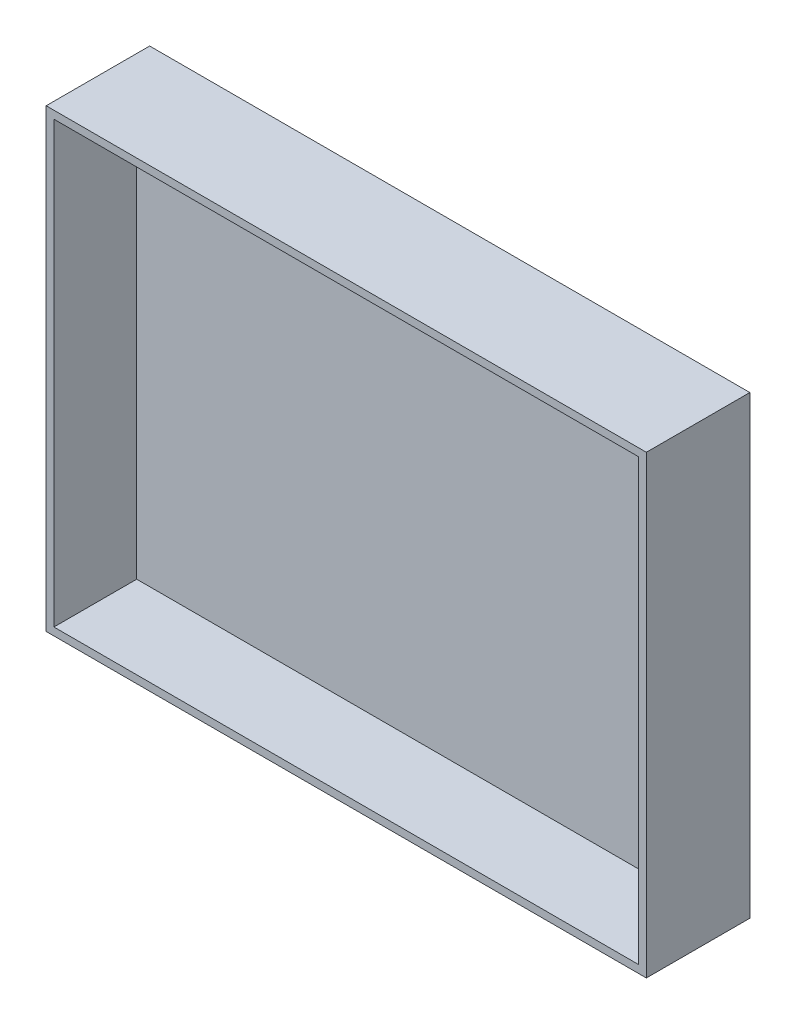
ISO-10303-21;
HEADER;
FILE_DESCRIPTION(('STEP AP214'),'2;1');
FILE_NAME('part.step','',(''),(''),'','','');
FILE_SCHEMA(('AUTOMOTIVE_DESIGN { 1 0 10303 214 1 1 1 1 }'));
ENDSEC;
DATA;
#1=APPLICATION_CONTEXT('core data for automotive mechanical design processes');
#2=APPLICATION_PROTOCOL_DEFINITION('international standard','automotive_design',2000,#1);
#3=PRODUCT_CONTEXT('',#1,'mechanical');
#4=PRODUCT('Part','Part','',(#3));
#5=PRODUCT_RELATED_PRODUCT_CATEGORY('part','',(#4));
#6=PRODUCT_DEFINITION_FORMATION('','',#4);
#7=PRODUCT_DEFINITION_CONTEXT('part definition',#1,'design');
#8=PRODUCT_DEFINITION('design','',#6,#7);
#9=PRODUCT_DEFINITION_SHAPE('','',#8);
#10=(LENGTH_UNIT() NAMED_UNIT(*) SI_UNIT(.MILLI.,.METRE.));
#11=(NAMED_UNIT(*) PLANE_ANGLE_UNIT() SI_UNIT($,.RADIAN.));
#12=(NAMED_UNIT(*) SI_UNIT($,.STERADIAN.) SOLID_ANGLE_UNIT());
#13=UNCERTAINTY_MEASURE_WITH_UNIT(LENGTH_MEASURE(1.E-05),#10,'distance_accuracy_value','');
#14=(GEOMETRIC_REPRESENTATION_CONTEXT(3) GLOBAL_UNCERTAINTY_ASSIGNED_CONTEXT((#13)) GLOBAL_UNIT_ASSIGNED_CONTEXT((#10,
#11,#12)) REPRESENTATION_CONTEXT('',''));
#15=CARTESIAN_POINT('',(0.,0.,0.));
#16=DIRECTION('',(0.,0.,1.));
#17=DIRECTION('',(1.,0.,0.));
#18=AXIS2_PLACEMENT_3D('',#15,#16,#17);
#19=CARTESIAN_POINT('',(28.25,-21.25,10.));
#20=DIRECTION('',(-1.,0.,0.));
#21=DIRECTION('',(0.,0.,1.));
#22=AXIS2_PLACEMENT_3D('',#19,#20,#21);
#23=PLANE('',#22);
#24=DIRECTION('',(0.,0.,-1.));
#25=VECTOR('',#24,1.);
#26=CARTESIAN_POINT('',(28.25,21.25,10.));
#27=LINE('',#26,#25);
#28=CARTESIAN_POINT('',(28.25,21.25,10.));
#29=VERTEX_POINT('',#28);
#30=CARTESIAN_POINT('',(28.25,21.25,2.));
#31=VERTEX_POINT('',#30);
#32=EDGE_CURVE('E112',#29,#31,#27,.T.);
#33=ORIENTED_EDGE('',*,*,#32,.T.);
#34=DIRECTION('',(0.,-1.,0.));
#35=VECTOR('',#34,1.);
#36=CARTESIAN_POINT('',(28.25,-21.25,2.));
#37=LINE('',#36,#35);
#38=CARTESIAN_POINT('',(28.25,-21.25,2.));
#39=VERTEX_POINT('',#38);
#40=EDGE_CURVE('E103',#31,#39,#37,.T.);
#41=ORIENTED_EDGE('',*,*,#40,.T.);
#42=DIRECTION('',(0.,0.,-1.));
#43=VECTOR('',#42,1.);
#44=CARTESIAN_POINT('',(28.25,-21.25,10.));
#45=LINE('',#44,#43);
#46=CARTESIAN_POINT('',(28.25,-21.25,10.));
#47=VERTEX_POINT('',#46);
#48=EDGE_CURVE('E109',#47,#39,#45,.T.);
#49=ORIENTED_EDGE('',*,*,#48,.F.);
#50=DIRECTION('',(0.,1.,0.));
#51=VECTOR('',#50,1.);
#52=CARTESIAN_POINT('',(28.25,-21.25,10.));
#53=LINE('',#52,#51);
#54=EDGE_CURVE('E114',#47,#29,#53,.T.);
#55=ORIENTED_EDGE('',*,*,#54,.T.);
#56=EDGE_LOOP('',(#33,#41,#49,#55));
#57=FACE_BOUND('',#56,.T.);
#58=ADVANCED_FACE('F39',(#57),#23,.T.);
#59=CARTESIAN_POINT('',(-28.25,21.25,10.));
#60=DIRECTION('',(0.,-1.,0.));
#61=DIRECTION('',(0.,0.,-1.));
#62=AXIS2_PLACEMENT_3D('',#59,#60,#61);
#63=PLANE('',#62);
#64=DIRECTION('',(0.,0.,-1.));
#65=VECTOR('',#64,1.);
#66=CARTESIAN_POINT('',(-28.25,21.25,10.));
#67=LINE('',#66,#65);
#68=CARTESIAN_POINT('',(-28.25,21.25,10.));
#69=VERTEX_POINT('',#68);
#70=CARTESIAN_POINT('',(-28.25,21.25,2.));
#71=VERTEX_POINT('',#70);
#72=EDGE_CURVE('E124',#69,#71,#67,.T.);
#73=ORIENTED_EDGE('',*,*,#72,.T.);
#74=DIRECTION('',(1.,0.,0.));
#75=VECTOR('',#74,1.);
#76=CARTESIAN_POINT('',(-28.25,21.25,2.));
#77=LINE('',#76,#75);
#78=EDGE_CURVE('E115',#71,#31,#77,.T.);
#79=ORIENTED_EDGE('',*,*,#78,.T.);
#80=ORIENTED_EDGE('',*,*,#32,.F.);
#81=DIRECTION('',(-1.,0.,0.));
#82=VECTOR('',#81,1.);
#83=CARTESIAN_POINT('',(-28.25,21.25,10.));
#84=LINE('',#83,#82);
#85=EDGE_CURVE('E200',#29,#69,#84,.T.);
#86=ORIENTED_EDGE('',*,*,#85,.T.);
#87=EDGE_LOOP('',(#73,#79,#80,#86));
#88=FACE_BOUND('',#87,.T.);
#89=ADVANCED_FACE('F214',(#88),#63,.T.);
#90=CARTESIAN_POINT('',(-28.25,-21.25,10.));
#91=DIRECTION('',(1.,0.,0.));
#92=DIRECTION('',(0.,0.,-1.));
#93=AXIS2_PLACEMENT_3D('',#90,#91,#92);
#94=PLANE('',#93);
#95=DIRECTION('',(0.,0.,-1.));
#96=VECTOR('',#95,1.);
#97=CARTESIAN_POINT('',(-28.25,-21.25,10.));
#98=LINE('',#97,#96);
#99=CARTESIAN_POINT('',(-28.25,-21.25,10.));
#100=VERTEX_POINT('',#99);
#101=CARTESIAN_POINT('',(-28.25,-21.25,2.));
#102=VERTEX_POINT('',#101);
#103=EDGE_CURVE('E61',#100,#102,#98,.T.);
#104=ORIENTED_EDGE('',*,*,#103,.T.);
#105=DIRECTION('',(0.,1.,0.));
#106=VECTOR('',#105,1.);
#107=CARTESIAN_POINT('',(-28.25,-21.25,2.));
#108=LINE('',#107,#106);
#109=EDGE_CURVE('E55',#102,#71,#108,.T.);
#110=ORIENTED_EDGE('',*,*,#109,.T.);
#111=ORIENTED_EDGE('',*,*,#72,.F.);
#112=DIRECTION('',(0.,-1.,0.));
#113=VECTOR('',#112,1.);
#114=CARTESIAN_POINT('',(-28.25,-21.25,10.));
#115=LINE('',#114,#113);
#116=EDGE_CURVE('E126',#69,#100,#115,.T.);
#117=ORIENTED_EDGE('',*,*,#116,.T.);
#118=EDGE_LOOP('',(#104,#110,#111,#117));
#119=FACE_BOUND('',#118,.T.);
#120=ADVANCED_FACE('F213',(#119),#94,.T.);
#121=CARTESIAN_POINT('',(-28.25,-21.25,10.));
#122=DIRECTION('',(0.,1.,0.));
#123=DIRECTION('',(0.,0.,1.));
#124=AXIS2_PLACEMENT_3D('',#121,#122,#123);
#125=PLANE('',#124);
#126=ORIENTED_EDGE('',*,*,#48,.T.);
#127=DIRECTION('',(-1.,0.,0.));
#128=VECTOR('',#127,1.);
#129=CARTESIAN_POINT('',(-28.25,-21.25,2.));
#130=LINE('',#129,#128);
#131=EDGE_CURVE('E11',#39,#102,#130,.T.);
#132=ORIENTED_EDGE('',*,*,#131,.T.);
#133=ORIENTED_EDGE('',*,*,#103,.F.);
#134=DIRECTION('',(1.,0.,0.));
#135=VECTOR('',#134,1.);
#136=CARTESIAN_POINT('',(-28.25,-21.25,10.));
#137=LINE('',#136,#135);
#138=EDGE_CURVE('E119',#100,#47,#137,.T.);
#139=ORIENTED_EDGE('',*,*,#138,.T.);
#140=EDGE_LOOP('',(#126,#132,#133,#139));
#141=FACE_BOUND('',#140,.T.);
#142=ADVANCED_FACE('F117',(#141),#125,.T.);
#143=CARTESIAN_POINT('',(0.,0.,10.));
#144=DIRECTION('',(0.,0.,1.));
#145=DIRECTION('',(1.,0.,0.));
#146=AXIS2_PLACEMENT_3D('',#143,#144,#145);
#147=PLANE('',#146);
#148=DIRECTION('',(0.,-1.,0.));
#149=VECTOR('',#148,1.);
#150=CARTESIAN_POINT('',(-29.,-22.,10.));
#151=LINE('',#150,#149);
#152=CARTESIAN_POINT('',(-29.,22.,10.));
#153=VERTEX_POINT('',#152);
#154=CARTESIAN_POINT('',(-29.,-22.,10.));
#155=VERTEX_POINT('',#154);
#156=EDGE_CURVE('E136',#153,#155,#151,.T.);
#157=ORIENTED_EDGE('',*,*,#156,.T.);
#158=DIRECTION('',(1.,0.,0.));
#159=VECTOR('',#158,1.);
#160=CARTESIAN_POINT('',(29.,-22.,10.));
#161=LINE('',#160,#159);
#162=CARTESIAN_POINT('',(29.,-22.,10.));
#163=VERTEX_POINT('',#162);
#164=EDGE_CURVE('E140',#155,#163,#161,.T.);
#165=ORIENTED_EDGE('',*,*,#164,.T.);
#166=DIRECTION('',(0.,1.,0.));
#167=VECTOR('',#166,1.);
#168=CARTESIAN_POINT('',(29.,-22.,10.));
#169=LINE('',#168,#167);
#170=CARTESIAN_POINT('',(29.,22.,10.));
#171=VERTEX_POINT('',#170);
#172=EDGE_CURVE('E144',#163,#171,#169,.T.);
#173=ORIENTED_EDGE('',*,*,#172,.T.);
#174=DIRECTION('',(-1.,0.,0.));
#175=VECTOR('',#174,1.);
#176=CARTESIAN_POINT('',(29.,22.,10.));
#177=LINE('',#176,#175);
#178=EDGE_CURVE('E147',#171,#153,#177,.T.);
#179=ORIENTED_EDGE('',*,*,#178,.T.);
#180=EDGE_LOOP('',(#157,#165,#173,#179));
#181=FACE_BOUND('',#180,.T.);
#182=ORIENTED_EDGE('',*,*,#85,.F.);
#183=ORIENTED_EDGE('',*,*,#54,.F.);
#184=ORIENTED_EDGE('',*,*,#138,.F.);
#185=ORIENTED_EDGE('',*,*,#116,.F.);
#186=EDGE_LOOP('',(#182,#183,#184,#185));
#187=FACE_BOUND('',#186,.T.);
#188=ADVANCED_FACE('F194',(#181,#187),#147,.T.);
#189=CARTESIAN_POINT('',(0.,0.,0.));
#190=DIRECTION('',(0.,0.,1.));
#191=DIRECTION('',(1.,0.,0.));
#192=AXIS2_PLACEMENT_3D('',#189,#190,#191);
#193=PLANE('',#192);
#194=DIRECTION('',(0.,-1.,0.));
#195=VECTOR('',#194,1.);
#196=CARTESIAN_POINT('',(-29.,-22.,0.));
#197=LINE('',#196,#195);
#198=CARTESIAN_POINT('',(-29.,22.,0.));
#199=VERTEX_POINT('',#198);
#200=CARTESIAN_POINT('',(-29.,-22.,0.));
#201=VERTEX_POINT('',#200);
#202=EDGE_CURVE('E135',#199,#201,#197,.T.);
#203=ORIENTED_EDGE('',*,*,#202,.F.);
#204=DIRECTION('',(-1.,0.,0.));
#205=VECTOR('',#204,1.);
#206=CARTESIAN_POINT('',(29.,22.,0.));
#207=LINE('',#206,#205);
#208=CARTESIAN_POINT('',(29.,22.,0.));
#209=VERTEX_POINT('',#208);
#210=EDGE_CURVE('E141',#209,#199,#207,.T.);
#211=ORIENTED_EDGE('',*,*,#210,.F.);
#212=DIRECTION('',(0.,1.,0.));
#213=VECTOR('',#212,1.);
#214=CARTESIAN_POINT('',(29.,-22.,0.));
#215=LINE('',#214,#213);
#216=CARTESIAN_POINT('',(29.,-22.,0.));
#217=VERTEX_POINT('',#216);
#218=EDGE_CURVE('E158',#217,#209,#215,.T.);
#219=ORIENTED_EDGE('',*,*,#218,.F.);
#220=DIRECTION('',(1.,0.,0.));
#221=VECTOR('',#220,1.);
#222=CARTESIAN_POINT('',(29.,-22.,0.));
#223=LINE('',#222,#221);
#224=EDGE_CURVE('E154',#201,#217,#223,.T.);
#225=ORIENTED_EDGE('',*,*,#224,.F.);
#226=EDGE_LOOP('',(#203,#211,#219,#225));
#227=FACE_BOUND('',#226,.T.);
#228=ADVANCED_FACE('F183',(#227),#193,.F.);
#229=CARTESIAN_POINT('',(-29.,-22.,10.));
#230=DIRECTION('',(1.,0.,0.));
#231=DIRECTION('',(0.,0.,-1.));
#232=AXIS2_PLACEMENT_3D('',#229,#230,#231);
#233=PLANE('',#232);
#234=ORIENTED_EDGE('',*,*,#202,.T.);
#235=DIRECTION('',(0.,0.,-1.));
#236=VECTOR('',#235,1.);
#237=CARTESIAN_POINT('',(-29.,-22.,10.));
#238=LINE('',#237,#236);
#239=EDGE_CURVE('E48',#155,#201,#238,.T.);
#240=ORIENTED_EDGE('',*,*,#239,.F.);
#241=ORIENTED_EDGE('',*,*,#156,.F.);
#242=DIRECTION('',(0.,0.,-1.));
#243=VECTOR('',#242,1.);
#244=CARTESIAN_POINT('',(-29.,22.,10.));
#245=LINE('',#244,#243);
#246=EDGE_CURVE('E150',#153,#199,#245,.T.);
#247=ORIENTED_EDGE('',*,*,#246,.T.);
#248=EDGE_LOOP('',(#234,#240,#241,#247));
#249=FACE_BOUND('',#248,.T.);
#250=ADVANCED_FACE('F41',(#249),#233,.F.);
#251=CARTESIAN_POINT('',(29.,-22.,10.));
#252=DIRECTION('',(0.,1.,0.));
#253=DIRECTION('',(-1.,0.,0.));
#254=AXIS2_PLACEMENT_3D('',#251,#252,#253);
#255=PLANE('',#254);
#256=ORIENTED_EDGE('',*,*,#224,.T.);
#257=DIRECTION('',(0.,0.,-1.));
#258=VECTOR('',#257,1.);
#259=CARTESIAN_POINT('',(29.,-22.,10.));
#260=LINE('',#259,#258);
#261=EDGE_CURVE('E170',#163,#217,#260,.T.);
#262=ORIENTED_EDGE('',*,*,#261,.F.);
#263=ORIENTED_EDGE('',*,*,#164,.F.);
#264=ORIENTED_EDGE('',*,*,#239,.T.);
#265=EDGE_LOOP('',(#256,#262,#263,#264));
#266=FACE_BOUND('',#265,.T.);
#267=ADVANCED_FACE('F176',(#266),#255,.F.);
#268=CARTESIAN_POINT('',(29.,-22.,10.));
#269=DIRECTION('',(-1.,0.,0.));
#270=DIRECTION('',(0.,-1.,0.));
#271=AXIS2_PLACEMENT_3D('',#268,#269,#270);
#272=PLANE('',#271);
#273=ORIENTED_EDGE('',*,*,#218,.T.);
#274=DIRECTION('',(0.,0.,-1.));
#275=VECTOR('',#274,1.);
#276=CARTESIAN_POINT('',(29.,22.,10.));
#277=LINE('',#276,#275);
#278=EDGE_CURVE('E167',#171,#209,#277,.T.);
#279=ORIENTED_EDGE('',*,*,#278,.F.);
#280=ORIENTED_EDGE('',*,*,#172,.F.);
#281=ORIENTED_EDGE('',*,*,#261,.T.);
#282=EDGE_LOOP('',(#273,#279,#280,#281));
#283=FACE_BOUND('',#282,.T.);
#284=ADVANCED_FACE('F192',(#283),#272,.F.);
#285=CARTESIAN_POINT('',(29.,22.,10.));
#286=DIRECTION('',(0.,-1.,0.));
#287=DIRECTION('',(1.,0.,0.));
#288=AXIS2_PLACEMENT_3D('',#285,#286,#287);
#289=PLANE('',#288);
#290=ORIENTED_EDGE('',*,*,#210,.T.);
#291=ORIENTED_EDGE('',*,*,#246,.F.);
#292=ORIENTED_EDGE('',*,*,#178,.F.);
#293=ORIENTED_EDGE('',*,*,#278,.T.);
#294=EDGE_LOOP('',(#290,#291,#292,#293));
#295=FACE_BOUND('',#294,.T.);
#296=ADVANCED_FACE('F188',(#295),#289,.F.);
#297=CARTESIAN_POINT('',(0.,0.,2.));
#298=DIRECTION('',(0.,0.,-1.));
#299=DIRECTION('',(-1.,0.,0.));
#300=AXIS2_PLACEMENT_3D('',#297,#298,#299);
#301=PLANE('',#300);
#302=ORIENTED_EDGE('',*,*,#40,.F.);
#303=ORIENTED_EDGE('',*,*,#78,.F.);
#304=ORIENTED_EDGE('',*,*,#109,.F.);
#305=ORIENTED_EDGE('',*,*,#131,.F.);
#306=EDGE_LOOP('',(#302,#303,#304,#305));
#307=FACE_BOUND('',#306,.T.);
#308=ADVANCED_FACE('F102',(#307),#301,.F.);
#309=CLOSED_SHELL('',(#58,#89,#120,#142,#188,#228,#250,#267,#284,#296,#308));
#310=MANIFOLD_SOLID_BREP('B2',#309);
#311=ADVANCED_BREP_SHAPE_REPRESENTATION('',(#18,#310),#14);
#312=SHAPE_DEFINITION_REPRESENTATION(#9,#311);
ENDSEC;
END-ISO-10303-21;
